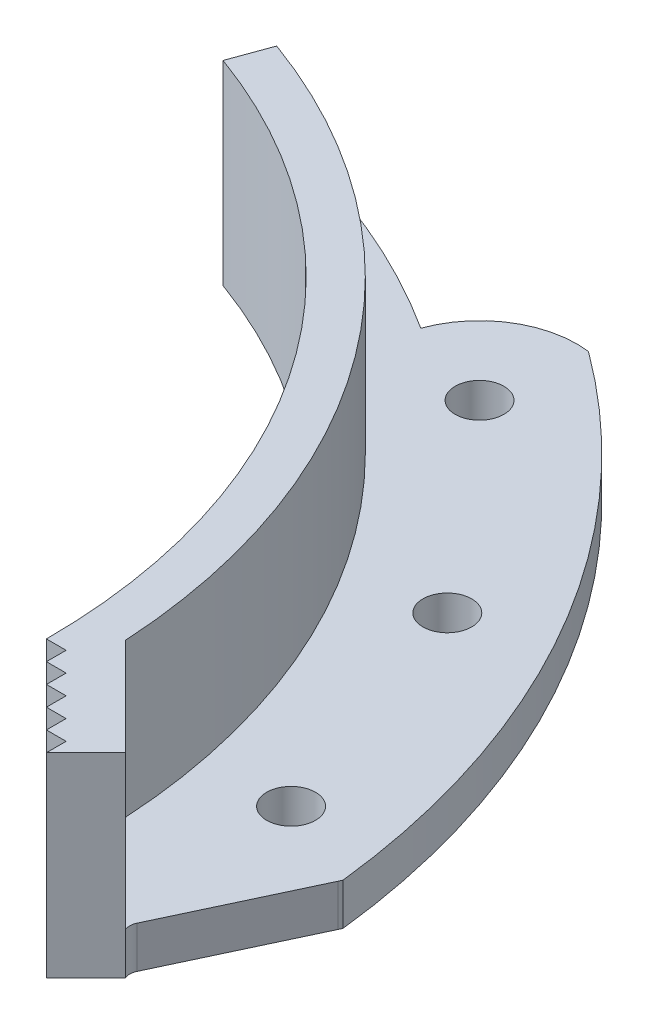
ISO-10303-21;
HEADER;
FILE_DESCRIPTION(('STEP AP214'),'2;1');
FILE_NAME('part.step','',(''),(''),'','','');
FILE_SCHEMA(('AUTOMOTIVE_DESIGN { 1 0 10303 214 1 1 1 1 }'));
ENDSEC;
DATA;
#1=APPLICATION_CONTEXT('core data for automotive mechanical design processes');
#2=APPLICATION_PROTOCOL_DEFINITION('international standard','automotive_design',2000,#1);
#3=PRODUCT_CONTEXT('',#1,'mechanical');
#4=PRODUCT('Part','Part','',(#3));
#5=PRODUCT_RELATED_PRODUCT_CATEGORY('part','',(#4));
#6=PRODUCT_DEFINITION_FORMATION('','',#4);
#7=PRODUCT_DEFINITION_CONTEXT('part definition',#1,'design');
#8=PRODUCT_DEFINITION('design','',#6,#7);
#9=PRODUCT_DEFINITION_SHAPE('','',#8);
#10=(LENGTH_UNIT() NAMED_UNIT(*) SI_UNIT(.MILLI.,.METRE.));
#11=(NAMED_UNIT(*) PLANE_ANGLE_UNIT() SI_UNIT($,.RADIAN.));
#12=(NAMED_UNIT(*) SI_UNIT($,.STERADIAN.) SOLID_ANGLE_UNIT());
#13=UNCERTAINTY_MEASURE_WITH_UNIT(LENGTH_MEASURE(1.E-05),#10,'distance_accuracy_value','');
#14=(GEOMETRIC_REPRESENTATION_CONTEXT(3) GLOBAL_UNCERTAINTY_ASSIGNED_CONTEXT((#13)) GLOBAL_UNIT_ASSIGNED_CONTEXT((#10,
#11,#12)) REPRESENTATION_CONTEXT('',''));
#15=CARTESIAN_POINT('',(0.,0.,0.));
#16=DIRECTION('',(0.,0.,1.));
#17=DIRECTION('',(1.,0.,0.));
#18=AXIS2_PLACEMENT_3D('',#15,#16,#17);
#19=CARTESIAN_POINT('',(0.,3.,0.));
#20=DIRECTION('',(0.,1.,0.));
#21=DIRECTION('',(0.,0.,1.));
#22=AXIS2_PLACEMENT_3D('',#19,#20,#21);
#23=PLANE('',#22);
#24=CARTESIAN_POINT('',(46.7653718043597,3.,-26.9999999999999));
#25=DIRECTION('',(0.,1.,0.));
#26=DIRECTION('',(0.,0.,1.));
#27=AXIS2_PLACEMENT_3D('',#24,#25,#26);
#28=CIRCLE('',#27,1.75);
#29=CARTESIAN_POINT('',(46.7653718043597,3.,-25.2499999999999));
#30=VERTEX_POINT('',#29);
#31=EDGE_CURVE('E283',#30,#30,#28,.T.);
#32=ORIENTED_EDGE('',*,*,#31,.F.);
#33=EDGE_LOOP('',(#32));
#34=FACE_BOUND('',#33,.T.);
#35=CARTESIAN_POINT('',(34.7105309230732,3.,-41.3663999284248));
#36=DIRECTION('',(0.,1.,0.));
#37=DIRECTION('',(0.,0.,1.));
#38=AXIS2_PLACEMENT_3D('',#35,#36,#37);
#39=CIRCLE('',#38,1.75);
#40=CARTESIAN_POINT('',(34.7105309230732,3.,-39.6163999284248));
#41=VERTEX_POINT('',#40);
#42=EDGE_CURVE('E289',#41,#41,#39,.T.);
#43=ORIENTED_EDGE('',*,*,#42,.F.);
#44=EDGE_LOOP('',(#43));
#45=FACE_BOUND('',#44,.T.);
#46=CARTESIAN_POINT('',(53.1796186626593,3.,-9.37700159401408));
#47=DIRECTION('',(0.,1.,0.));
#48=DIRECTION('',(0.,0.,1.));
#49=AXIS2_PLACEMENT_3D('',#46,#47,#48);
#50=CIRCLE('',#49,1.75);
#51=CARTESIAN_POINT('',(53.1796186626593,3.,-7.62700159401407));
#52=VERTEX_POINT('',#51);
#53=EDGE_CURVE('E277',#52,#52,#50,.T.);
#54=ORIENTED_EDGE('',*,*,#53,.F.);
#55=EDGE_LOOP('',(#54));
#56=FACE_BOUND('',#55,.T.);
#57=CARTESIAN_POINT('',(53.1796186626593,3.,-9.37700159401408));
#58=DIRECTION('',(0.,1.,0.));
#59=DIRECTION('',(0.,0.,1.));
#60=AXIS2_PLACEMENT_3D('',#57,#58,#59);
#61=CIRCLE('',#60,7.);
#62=CARTESIAN_POINT('',(59.5172883699741,3.,-6.40480666753561));
#63=VERTEX_POINT('',#62);
#64=CARTESIAN_POINT('',(59.6295570389033,3.,-6.65702090609462));
#65=VERTEX_POINT('',#64);
#66=EDGE_CURVE('E295',#63,#65,#61,.T.);
#67=ORIENTED_EDGE('',*,*,#66,.T.);
#68=CARTESIAN_POINT('',(0.,3.,0.));
#69=DIRECTION('',(0.,1.,0.));
#70=DIRECTION('',(0.,0.,1.));
#71=AXIS2_PLACEMENT_3D('',#68,#69,#70);
#72=CIRCLE('',#71,60.);
#73=CARTESIAN_POINT('',(35.5799277376538,3.,-48.312200759056));
#74=VERTEX_POINT('',#73);
#75=EDGE_CURVE('E184',#65,#74,#72,.T.);
#76=ORIENTED_EDGE('',*,*,#75,.T.);
#77=CARTESIAN_POINT('',(34.7105309230732,3.,-41.3663999284248));
#78=DIRECTION('',(0.,1.,0.));
#79=DIRECTION('',(0.,0.,1.));
#80=AXIS2_PLACEMENT_3D('',#77,#78,#79);
#81=CIRCLE('',#80,7.00000000000003);
#82=CARTESIAN_POINT('',(28.1245174082846,3.,-43.7379871570594));
#83=VERTEX_POINT('',#82);
#84=EDGE_CURVE('E297',#74,#83,#81,.T.);
#85=ORIENTED_EDGE('',*,*,#84,.T.);
#86=CARTESIAN_POINT('',(0.,3.,0.));
#87=DIRECTION('',(0.,1.,0.));
#88=DIRECTION('',(0.,0.,1.));
#89=AXIS2_PLACEMENT_3D('',#86,#87,#88);
#90=CIRCLE('',#89,52.);
#91=CARTESIAN_POINT('',(17.7850474529348,3.,-48.8640162808672));
#92=VERTEX_POINT('',#91);
#93=EDGE_CURVE('E299',#83,#92,#90,.T.);
#94=ORIENTED_EDGE('',*,*,#93,.T.);
#95=DIRECTION('',(-0.34202014332567,0.,0.939692620785908));
#96=VECTOR('',#95,1.);
#97=CARTESIAN_POINT('',(15.3909064496551,3.,-42.2861679353659));
#98=LINE('',#97,#96);
#99=CARTESIAN_POINT('',(16.4169668796321,3.,-45.1052457977236));
#100=VERTEX_POINT('',#99);
#101=EDGE_CURVE('E220',#92,#100,#98,.T.);
#102=ORIENTED_EDGE('',*,*,#101,.T.);
#103=CARTESIAN_POINT('',(0.,3.,0.));
#104=DIRECTION('',(0.,1.,0.));
#105=DIRECTION('',(0.,0.,1.));
#106=AXIS2_PLACEMENT_3D('',#103,#104,#105);
#107=CIRCLE('',#106,48.);
#108=CARTESIAN_POINT('',(47.9220275325259,3.,-2.73482671696649));
#109=VERTEX_POINT('',#108);
#110=EDGE_CURVE('E272',#109,#100,#107,.T.);
#111=ORIENTED_EDGE('',*,*,#110,.F.);
#112=DIRECTION('',(-0.707106781186548,0.,-0.707106781186547));
#113=VECTOR('',#112,1.);
#114=CARTESIAN_POINT('',(25.3284271247462,3.,-25.3284271247462));
#115=LINE('',#114,#113);
#116=CARTESIAN_POINT('',(54.8994949366116,3.,4.24264068711928));
#117=VERTEX_POINT('',#116);
#118=EDGE_CURVE('E48',#117,#109,#115,.T.);
#119=ORIENTED_EDGE('',*,*,#118,.F.);
#120=CARTESIAN_POINT('',(55.816015269397,3.,3.84265258780769));
#121=DIRECTION('',(0.,1.,0.));
#122=DIRECTION('',(0.,0.,1.));
#123=AXIS2_PLACEMENT_3D('',#120,#121,#122);
#124=CIRCLE('',#123,1.);
#125=CARTESIAN_POINT('',(54.9106338826378,3.,3.41805331259648));
#126=VERTEX_POINT('',#125);
#127=EDGE_CURVE('E11',#117,#126,#124,.F.);
#128=ORIENTED_EDGE('',*,*,#127,.T.);
#129=DIRECTION('',(0.424599275211209,0.,-0.905381386759258));
#130=VECTOR('',#129,1.);
#131=CARTESIAN_POINT('',(54.1923725989452,3.,4.94961597662027));
#132=LINE('',#131,#130);
#133=EDGE_CURVE('E215',#126,#63,#132,.T.);
#134=ORIENTED_EDGE('',*,*,#133,.T.);
#135=EDGE_LOOP('',(#67,#76,#85,#94,#102,#111,#119,#128,#134));
#136=FACE_BOUND('',#135,.T.);
#137=ADVANCED_FACE('F34',(#34,#45,#56,#136),#23,.T.);
#138=CARTESIAN_POINT('',(0.,0.,0.));
#139=DIRECTION('',(0.,1.,0.));
#140=DIRECTION('',(0.,0.,1.));
#141=AXIS2_PLACEMENT_3D('',#138,#139,#140);
#142=PLANE('',#141);
#143=CARTESIAN_POINT('',(53.1796186626593,0.,-9.37700159401408));
#144=DIRECTION('',(0.,1.,0.));
#145=DIRECTION('',(0.,0.,1.));
#146=AXIS2_PLACEMENT_3D('',#143,#144,#145);
#147=CIRCLE('',#146,1.75);
#148=CARTESIAN_POINT('',(53.1796186626593,0.,-7.62700159401407));
#149=VERTEX_POINT('',#148);
#150=EDGE_CURVE('E276',#149,#149,#147,.T.);
#151=ORIENTED_EDGE('',*,*,#150,.T.);
#152=EDGE_LOOP('',(#151));
#153=FACE_BOUND('',#152,.T.);
#154=CARTESIAN_POINT('',(46.7653718043597,0.,-26.9999999999999));
#155=DIRECTION('',(0.,1.,0.));
#156=DIRECTION('',(0.,0.,1.));
#157=AXIS2_PLACEMENT_3D('',#154,#155,#156);
#158=CIRCLE('',#157,1.75);
#159=CARTESIAN_POINT('',(46.7653718043597,0.,-25.2499999999999));
#160=VERTEX_POINT('',#159);
#161=EDGE_CURVE('E280',#160,#160,#158,.T.);
#162=ORIENTED_EDGE('',*,*,#161,.T.);
#163=EDGE_LOOP('',(#162));
#164=FACE_BOUND('',#163,.T.);
#165=CARTESIAN_POINT('',(34.7105309230732,0.,-41.3663999284248));
#166=DIRECTION('',(0.,1.,0.));
#167=DIRECTION('',(0.,0.,1.));
#168=AXIS2_PLACEMENT_3D('',#165,#166,#167);
#169=CIRCLE('',#168,1.75);
#170=CARTESIAN_POINT('',(34.7105309230732,0.,-39.6163999284248));
#171=VERTEX_POINT('',#170);
#172=EDGE_CURVE('E286',#171,#171,#169,.T.);
#173=ORIENTED_EDGE('',*,*,#172,.T.);
#174=EDGE_LOOP('',(#173));
#175=FACE_BOUND('',#174,.T.);
#176=CARTESIAN_POINT('',(0.,0.,0.));
#177=DIRECTION('',(0.,1.,0.));
#178=DIRECTION('',(0.,0.,1.));
#179=AXIS2_PLACEMENT_3D('',#176,#177,#178);
#180=CIRCLE('',#179,60.);
#181=CARTESIAN_POINT('',(59.6295570389033,0.,-6.65702090609462));
#182=VERTEX_POINT('',#181);
#183=CARTESIAN_POINT('',(35.5799277376538,0.,-48.312200759056));
#184=VERTEX_POINT('',#183);
#185=EDGE_CURVE('E181',#182,#184,#180,.T.);
#186=ORIENTED_EDGE('',*,*,#185,.F.);
#187=CARTESIAN_POINT('',(53.1796186626593,0.,-9.37700159401408));
#188=DIRECTION('',(0.,1.,0.));
#189=DIRECTION('',(0.,0.,1.));
#190=AXIS2_PLACEMENT_3D('',#187,#188,#189);
#191=CIRCLE('',#190,7.);
#192=CARTESIAN_POINT('',(59.5172883699741,0.,-6.40480666753561));
#193=VERTEX_POINT('',#192);
#194=EDGE_CURVE('E196',#193,#182,#191,.T.);
#195=ORIENTED_EDGE('',*,*,#194,.F.);
#196=DIRECTION('',(0.424599275211209,0.,-0.905381386759258));
#197=VECTOR('',#196,1.);
#198=CARTESIAN_POINT('',(54.1923725989452,0.,4.94961597662027));
#199=LINE('',#198,#197);
#200=CARTESIAN_POINT('',(54.9106338826378,0.,3.41805331259648));
#201=VERTEX_POINT('',#200);
#202=EDGE_CURVE('E204',#201,#193,#199,.T.);
#203=ORIENTED_EDGE('',*,*,#202,.F.);
#204=CARTESIAN_POINT('',(55.816015269397,0.,3.84265258780769));
#205=DIRECTION('',(0.,1.,0.));
#206=DIRECTION('',(0.,0.,1.));
#207=AXIS2_PLACEMENT_3D('',#204,#205,#206);
#208=CIRCLE('',#207,1.);
#209=CARTESIAN_POINT('',(54.8994949366116,0.,4.24264068711928));
#210=VERTEX_POINT('',#209);
#211=EDGE_CURVE('E42',#201,#210,#208,.T.);
#212=ORIENTED_EDGE('',*,*,#211,.T.);
#213=DIRECTION('',(0.70710678118654,0.,-0.707106781186555));
#214=VECTOR('',#213,1.);
#215=CARTESIAN_POINT('',(52.0710678118655,0.,7.07106781186548));
#216=LINE('',#215,#214);
#217=CARTESIAN_POINT('',(52.0710678118655,0.,7.07106781186548));
#218=VERTEX_POINT('',#217);
#219=EDGE_CURVE('E233',#218,#210,#216,.T.);
#220=ORIENTED_EDGE('',*,*,#219,.F.);
#221=DIRECTION('',(0.,0.,1.));
#222=VECTOR('',#221,1.);
#223=CARTESIAN_POINT('',(52.0710678118655,0.,7.07106781186548));
#224=LINE('',#223,#222);
#225=CARTESIAN_POINT('',(52.0710678118655,0.,5.65685424949239));
#226=VERTEX_POINT('',#225);
#227=EDGE_CURVE('E243',#226,#218,#224,.T.);
#228=ORIENTED_EDGE('',*,*,#227,.F.);
#229=DIRECTION('',(1.,0.,0.));
#230=VECTOR('',#229,1.);
#231=CARTESIAN_POINT('',(52.0710678118655,0.,5.65685424949239));
#232=LINE('',#231,#230);
#233=CARTESIAN_POINT('',(50.6568542494924,0.,5.65685424949239));
#234=VERTEX_POINT('',#233);
#235=EDGE_CURVE('E346',#234,#226,#232,.T.);
#236=ORIENTED_EDGE('',*,*,#235,.F.);
#237=DIRECTION('',(0.,0.,1.));
#238=VECTOR('',#237,1.);
#239=CARTESIAN_POINT('',(50.6568542494924,0.,5.65685424949239));
#240=LINE('',#239,#238);
#241=CARTESIAN_POINT('',(50.6568542494924,0.,4.2426406871193));
#242=VERTEX_POINT('',#241);
#243=EDGE_CURVE('E343',#242,#234,#240,.T.);
#244=ORIENTED_EDGE('',*,*,#243,.F.);
#245=DIRECTION('',(1.,0.,0.));
#246=VECTOR('',#245,1.);
#247=CARTESIAN_POINT('',(50.6568542494924,0.,4.2426406871193));
#248=LINE('',#247,#246);
#249=CARTESIAN_POINT('',(49.2426406871192,0.,4.24264068711929));
#250=VERTEX_POINT('',#249);
#251=EDGE_CURVE('E340',#250,#242,#248,.T.);
#252=ORIENTED_EDGE('',*,*,#251,.F.);
#253=DIRECTION('',(0.,0.,1.));
#254=VECTOR('',#253,1.);
#255=CARTESIAN_POINT('',(49.2426406871192,0.,4.24264068711929));
#256=LINE('',#255,#254);
#257=CARTESIAN_POINT('',(49.2426406871193,0.,2.82842712474621));
#258=VERTEX_POINT('',#257);
#259=EDGE_CURVE('E337',#258,#250,#256,.T.);
#260=ORIENTED_EDGE('',*,*,#259,.F.);
#261=DIRECTION('',(1.,0.,0.));
#262=VECTOR('',#261,1.);
#263=CARTESIAN_POINT('',(49.2426406871193,0.,2.82842712474621));
#264=LINE('',#263,#262);
#265=CARTESIAN_POINT('',(47.8284271247462,0.,2.82842712474622));
#266=VERTEX_POINT('',#265);
#267=EDGE_CURVE('E334',#266,#258,#264,.T.);
#268=ORIENTED_EDGE('',*,*,#267,.F.);
#269=DIRECTION('',(0.,0.,1.));
#270=VECTOR('',#269,1.);
#271=CARTESIAN_POINT('',(47.8284271247462,0.,2.82842712474622));
#272=LINE('',#271,#270);
#273=CARTESIAN_POINT('',(47.8284271247462,0.,1.41421356237313));
#274=VERTEX_POINT('',#273);
#275=EDGE_CURVE('E331',#274,#266,#272,.T.);
#276=ORIENTED_EDGE('',*,*,#275,.F.);
#277=DIRECTION('',(1.,0.,0.));
#278=VECTOR('',#277,1.);
#279=CARTESIAN_POINT('',(47.8284271247462,0.,1.41421356237313));
#280=LINE('',#279,#278);
#281=CARTESIAN_POINT('',(46.4142135623731,0.,1.41421356237313));
#282=VERTEX_POINT('',#281);
#283=EDGE_CURVE('E322',#282,#274,#280,.T.);
#284=ORIENTED_EDGE('',*,*,#283,.F.);
#285=DIRECTION('',(0.,0.,1.));
#286=VECTOR('',#285,1.);
#287=CARTESIAN_POINT('',(46.4142135623731,0.,1.41421356237313));
#288=LINE('',#287,#286);
#289=CARTESIAN_POINT('',(46.4142135623731,0.,0.));
#290=VERTEX_POINT('',#289);
#291=EDGE_CURVE('E319',#290,#282,#288,.T.);
#292=ORIENTED_EDGE('',*,*,#291,.F.);
#293=DIRECTION('',(1.,0.,5.07213462238583E-13));
#294=VECTOR('',#293,1.);
#295=CARTESIAN_POINT('',(46.4142135623731,0.,0.));
#296=LINE('',#295,#294);
#297=CARTESIAN_POINT('',(44.9999999999992,0.,-6.73072708679001E-13));
#298=VERTEX_POINT('',#297);
#299=EDGE_CURVE('E312',#298,#290,#296,.T.);
#300=ORIENTED_EDGE('',*,*,#299,.F.);
#301=CARTESIAN_POINT('',(0.,0.,0.));
#302=DIRECTION('',(0.,-1.,0.));
#303=DIRECTION('',(0.,0.,1.));
#304=AXIS2_PLACEMENT_3D('',#301,#302,#303);
#305=CIRCLE('',#304,45.);
#306=CARTESIAN_POINT('',(15.3909064496551,0.,-42.2861679353659));
#307=VERTEX_POINT('',#306);
#308=EDGE_CURVE('E208',#307,#298,#305,.T.);
#309=ORIENTED_EDGE('',*,*,#308,.F.);
#310=DIRECTION('',(-0.34202014332567,0.,0.939692620785908));
#311=VECTOR('',#310,1.);
#312=CARTESIAN_POINT('',(15.3909064496551,0.,-42.2861679353659));
#313=LINE('',#312,#311);
#314=CARTESIAN_POINT('',(17.7850474529348,0.,-48.8640162808672));
#315=VERTEX_POINT('',#314);
#316=EDGE_CURVE('E213',#315,#307,#313,.T.);
#317=ORIENTED_EDGE('',*,*,#316,.F.);
#318=CARTESIAN_POINT('',(0.,0.,0.));
#319=DIRECTION('',(0.,1.,0.));
#320=DIRECTION('',(0.,0.,1.));
#321=AXIS2_PLACEMENT_3D('',#318,#319,#320);
#322=CIRCLE('',#321,52.);
#323=CARTESIAN_POINT('',(28.1245174082846,0.,-43.7379871570594));
#324=VERTEX_POINT('',#323);
#325=EDGE_CURVE('E206',#324,#315,#322,.T.);
#326=ORIENTED_EDGE('',*,*,#325,.F.);
#327=CARTESIAN_POINT('',(34.7105309230732,0.,-41.3663999284248));
#328=DIRECTION('',(0.,1.,0.));
#329=DIRECTION('',(0.,0.,1.));
#330=AXIS2_PLACEMENT_3D('',#327,#328,#329);
#331=CIRCLE('',#330,7.00000000000003);
#332=EDGE_CURVE('E198',#184,#324,#331,.T.);
#333=ORIENTED_EDGE('',*,*,#332,.F.);
#334=EDGE_LOOP('',(#186,#195,#203,#212,#220,#228,#236,#244,#252,#260,#268,#276,#284,#292,#300,
#309,#317,#326,#333));
#335=FACE_BOUND('',#334,.T.);
#336=ADVANCED_FACE('F194',(#153,#164,#175,#335),#142,.F.);
#337=CARTESIAN_POINT('',(53.1796186626593,3.,-9.37700159401408));
#338=DIRECTION('',(0.,-1.,0.));
#339=DIRECTION('',(0.,0.,-1.));
#340=AXIS2_PLACEMENT_3D('',#337,#338,#339);
#341=CYLINDRICAL_SURFACE('',#340,7.);
#342=DIRECTION('',(0.,1.,0.));
#343=VECTOR('',#342,1.);
#344=CARTESIAN_POINT('',(59.6295570389033,7.,-6.65702090609462));
#345=LINE('',#344,#343);
#346=EDGE_CURVE('E178',#65,#182,#345,.F.);
#347=ORIENTED_EDGE('',*,*,#346,.F.);
#348=ORIENTED_EDGE('',*,*,#66,.F.);
#349=DIRECTION('',(0.,-1.,0.));
#350=VECTOR('',#349,1.);
#351=CARTESIAN_POINT('',(59.5172883699741,3.,-6.40480666753561));
#352=LINE('',#351,#350);
#353=EDGE_CURVE('E203',#63,#193,#352,.T.);
#354=ORIENTED_EDGE('',*,*,#353,.T.);
#355=ORIENTED_EDGE('',*,*,#194,.T.);
#356=EDGE_LOOP('',(#347,#348,#354,#355));
#357=FACE_BOUND('',#356,.T.);
#358=ADVANCED_FACE('F201',(#357),#341,.T.);
#359=CARTESIAN_POINT('',(34.7105309230732,3.,-41.3663999284248));
#360=DIRECTION('',(0.,-1.,0.));
#361=DIRECTION('',(0.,0.,-1.));
#362=AXIS2_PLACEMENT_3D('',#359,#360,#361);
#363=CYLINDRICAL_SURFACE('',#362,7.00000000000003);
#364=DIRECTION('',(0.,1.,0.));
#365=VECTOR('',#364,1.);
#366=CARTESIAN_POINT('',(35.5799277376538,7.,-48.312200759056));
#367=LINE('',#366,#365);
#368=EDGE_CURVE('E227',#184,#74,#367,.T.);
#369=ORIENTED_EDGE('',*,*,#368,.F.);
#370=ORIENTED_EDGE('',*,*,#332,.T.);
#371=DIRECTION('',(0.,-1.,0.));
#372=VECTOR('',#371,1.);
#373=CARTESIAN_POINT('',(28.1245174082846,3.,-43.7379871570594));
#374=LINE('',#373,#372);
#375=EDGE_CURVE('E223',#83,#324,#374,.T.);
#376=ORIENTED_EDGE('',*,*,#375,.F.);
#377=ORIENTED_EDGE('',*,*,#84,.F.);
#378=EDGE_LOOP('',(#369,#370,#376,#377));
#379=FACE_BOUND('',#378,.T.);
#380=ADVANCED_FACE('F372',(#379),#363,.T.);
#381=CARTESIAN_POINT('',(0.,3.,0.));
#382=DIRECTION('',(0.,-1.,0.));
#383=DIRECTION('',(0.,0.,-1.));
#384=AXIS2_PLACEMENT_3D('',#381,#382,#383);
#385=CYLINDRICAL_SURFACE('',#384,45.);
#386=ORIENTED_EDGE('',*,*,#308,.T.);
#387=DIRECTION('',(0.,1.,0.));
#388=VECTOR('',#387,1.);
#389=CARTESIAN_POINT('',(44.9999999999992,0.,-6.73072708679001E-13));
#390=LINE('',#389,#388);
#391=CARTESIAN_POINT('',(44.9999999999992,14.,-6.73072708679001E-13));
#392=VERTEX_POINT('',#391);
#393=EDGE_CURVE('E242',#298,#392,#390,.T.);
#394=ORIENTED_EDGE('',*,*,#393,.T.);
#395=CARTESIAN_POINT('',(0.,14.,0.));
#396=DIRECTION('',(0.,-1.,0.));
#397=DIRECTION('',(0.,0.,1.));
#398=AXIS2_PLACEMENT_3D('',#395,#396,#397);
#399=CIRCLE('',#398,44.9999999999998);
#400=CARTESIAN_POINT('',(15.3909064496552,14.,-42.2861679353662));
#401=VERTEX_POINT('',#400);
#402=EDGE_CURVE('E189',#401,#392,#399,.T.);
#403=ORIENTED_EDGE('',*,*,#402,.F.);
#404=DIRECTION('',(0.,-1.,0.));
#405=VECTOR('',#404,1.);
#406=CARTESIAN_POINT('',(15.3909064496551,3.,-42.2861679353659));
#407=LINE('',#406,#405);
#408=EDGE_CURVE('E216',#401,#307,#407,.T.);
#409=ORIENTED_EDGE('',*,*,#408,.T.);
#410=EDGE_LOOP('',(#386,#394,#403,#409));
#411=FACE_BOUND('',#410,.T.);
#412=ADVANCED_FACE('F304',(#411),#385,.F.);
#413=CARTESIAN_POINT('',(54.1923725989452,3.,4.94961597662027));
#414=DIRECTION('',(-0.905381386759258,0.,-0.424599275211208));
#415=DIRECTION('',(-0.424599275211209,0.,0.905381386759258));
#416=AXIS2_PLACEMENT_3D('',#413,#414,#415);
#417=PLANE('',#416);
#418=ORIENTED_EDGE('',*,*,#133,.F.);
#419=DIRECTION('',(0.,-1.,0.));
#420=VECTOR('',#419,1.);
#421=CARTESIAN_POINT('',(54.9106338826378,3.,3.41805331259648));
#422=LINE('',#421,#420);
#423=EDGE_CURVE('E229',#126,#201,#422,.T.);
#424=ORIENTED_EDGE('',*,*,#423,.T.);
#425=ORIENTED_EDGE('',*,*,#202,.T.);
#426=ORIENTED_EDGE('',*,*,#353,.F.);
#427=EDGE_LOOP('',(#418,#424,#425,#426));
#428=FACE_BOUND('',#427,.T.);
#429=ADVANCED_FACE('F437',(#428),#417,.F.);
#430=CARTESIAN_POINT('',(0.,3.,0.));
#431=DIRECTION('',(0.,-1.,0.));
#432=DIRECTION('',(0.,0.,-1.));
#433=AXIS2_PLACEMENT_3D('',#430,#431,#432);
#434=CYLINDRICAL_SURFACE('',#433,52.);
#435=ORIENTED_EDGE('',*,*,#325,.T.);
#436=DIRECTION('',(0.,-1.,0.));
#437=VECTOR('',#436,1.);
#438=CARTESIAN_POINT('',(17.7850474529348,3.,-48.8640162808672));
#439=LINE('',#438,#437);
#440=EDGE_CURVE('E219',#92,#315,#439,.T.);
#441=ORIENTED_EDGE('',*,*,#440,.F.);
#442=ORIENTED_EDGE('',*,*,#93,.F.);
#443=ORIENTED_EDGE('',*,*,#375,.T.);
#444=EDGE_LOOP('',(#435,#441,#442,#443));
#445=FACE_BOUND('',#444,.T.);
#446=ADVANCED_FACE('F367',(#445),#434,.T.);
#447=CARTESIAN_POINT('',(15.3909064496551,3.,-42.2861679353659));
#448=DIRECTION('',(0.939692620785908,0.,0.342020143325669));
#449=DIRECTION('',(0.342020143325669,0.,-0.939692620785908));
#450=AXIS2_PLACEMENT_3D('',#447,#448,#449);
#451=PLANE('',#450);
#452=ORIENTED_EDGE('',*,*,#316,.T.);
#453=ORIENTED_EDGE('',*,*,#408,.F.);
#454=DIRECTION('',(-0.34202014332567,0.,0.939692620785908));
#455=VECTOR('',#454,1.);
#456=CARTESIAN_POINT('',(15.3909064496552,14.,-42.2861679353662));
#457=LINE('',#456,#455);
#458=CARTESIAN_POINT('',(16.4169668796321,14.,-45.1052457977236));
#459=VERTEX_POINT('',#458);
#460=EDGE_CURVE('E320',#459,#401,#457,.T.);
#461=ORIENTED_EDGE('',*,*,#460,.F.);
#462=DIRECTION('',(0.,1.,0.));
#463=VECTOR('',#462,1.);
#464=CARTESIAN_POINT('',(16.4169668796321,0.,-45.1052457977236));
#465=LINE('',#464,#463);
#466=EDGE_CURVE('E248',#100,#459,#465,.T.);
#467=ORIENTED_EDGE('',*,*,#466,.F.);
#468=ORIENTED_EDGE('',*,*,#101,.F.);
#469=ORIENTED_EDGE('',*,*,#440,.T.);
#470=EDGE_LOOP('',(#452,#453,#461,#467,#468,#469));
#471=FACE_BOUND('',#470,.T.);
#472=ADVANCED_FACE('F364',(#471),#451,.F.);
#473=CARTESIAN_POINT('',(34.7105309230732,3.,-41.3663999284248));
#474=DIRECTION('',(0.,-1.,0.));
#475=DIRECTION('',(0.,0.,-1.));
#476=AXIS2_PLACEMENT_3D('',#473,#474,#475);
#477=CYLINDRICAL_SURFACE('',#476,1.75);
#478=ORIENTED_EDGE('',*,*,#42,.T.);
#479=EDGE_LOOP('',(#478));
#480=FACE_BOUND('',#479,.T.);
#481=ORIENTED_EDGE('',*,*,#172,.F.);
#482=EDGE_LOOP('',(#481));
#483=FACE_BOUND('',#482,.T.);
#484=ADVANCED_FACE('F430',(#480,#483),#477,.F.);
#485=CARTESIAN_POINT('',(46.7653718043597,3.,-26.9999999999999));
#486=DIRECTION('',(0.,-1.,0.));
#487=DIRECTION('',(0.,0.,-1.));
#488=AXIS2_PLACEMENT_3D('',#485,#486,#487);
#489=CYLINDRICAL_SURFACE('',#488,1.75);
#490=ORIENTED_EDGE('',*,*,#31,.T.);
#491=EDGE_LOOP('',(#490));
#492=FACE_BOUND('',#491,.T.);
#493=ORIENTED_EDGE('',*,*,#161,.F.);
#494=EDGE_LOOP('',(#493));
#495=FACE_BOUND('',#494,.T.);
#496=ADVANCED_FACE('F470',(#492,#495),#489,.F.);
#497=CARTESIAN_POINT('',(53.1796186626593,3.,-9.37700159401408));
#498=DIRECTION('',(0.,-1.,0.));
#499=DIRECTION('',(0.,0.,-1.));
#500=AXIS2_PLACEMENT_3D('',#497,#498,#499);
#501=CYLINDRICAL_SURFACE('',#500,1.75);
#502=ORIENTED_EDGE('',*,*,#53,.T.);
#503=EDGE_LOOP('',(#502));
#504=FACE_BOUND('',#503,.T.);
#505=ORIENTED_EDGE('',*,*,#150,.F.);
#506=EDGE_LOOP('',(#505));
#507=FACE_BOUND('',#506,.T.);
#508=ADVANCED_FACE('F417',(#504,#507),#501,.F.);
#509=CARTESIAN_POINT('',(0.,0.,0.));
#510=DIRECTION('',(0.,1.,0.));
#511=DIRECTION('',(0.,0.,1.));
#512=AXIS2_PLACEMENT_3D('',#509,#510,#511);
#513=CYLINDRICAL_SURFACE('',#512,48.);
#514=DIRECTION('',(0.,1.,0.));
#515=VECTOR('',#514,1.);
#516=CARTESIAN_POINT('',(47.9220275325259,0.,-2.73482671696648));
#517=LINE('',#516,#515);
#518=CARTESIAN_POINT('',(47.9220275325259,14.,-2.73482671696648));
#519=VERTEX_POINT('',#518);
#520=EDGE_CURVE('E245',#109,#519,#517,.T.);
#521=ORIENTED_EDGE('',*,*,#520,.F.);
#522=ORIENTED_EDGE('',*,*,#110,.T.);
#523=ORIENTED_EDGE('',*,*,#466,.T.);
#524=CARTESIAN_POINT('',(0.,14.,0.));
#525=DIRECTION('',(0.,1.,0.));
#526=DIRECTION('',(0.,0.,1.));
#527=AXIS2_PLACEMENT_3D('',#524,#525,#526);
#528=CIRCLE('',#527,48.);
#529=EDGE_CURVE('E325',#519,#459,#528,.T.);
#530=ORIENTED_EDGE('',*,*,#529,.F.);
#531=EDGE_LOOP('',(#521,#522,#523,#530));
#532=FACE_BOUND('',#531,.T.);
#533=ADVANCED_FACE('F354',(#532),#513,.T.);
#534=CARTESIAN_POINT('',(54.8994949366116,0.,4.24264068711928));
#535=DIRECTION('',(0.707106781186547,0.,-0.707106781186548));
#536=DIRECTION('',(-0.707106781186548,0.,-0.707106781186547));
#537=AXIS2_PLACEMENT_3D('',#534,#535,#536);
#538=PLANE('',#537);
#539=DIRECTION('',(0.,1.,0.));
#540=VECTOR('',#539,1.);
#541=CARTESIAN_POINT('',(54.8994949366116,0.,4.24264068711928));
#542=LINE('',#541,#540);
#543=CARTESIAN_POINT('',(54.8994949366116,14.,4.24264068711928));
#544=VERTEX_POINT('',#543);
#545=EDGE_CURVE('E246',#117,#544,#542,.T.);
#546=ORIENTED_EDGE('',*,*,#545,.F.);
#547=ORIENTED_EDGE('',*,*,#118,.T.);
#548=ORIENTED_EDGE('',*,*,#520,.T.);
#549=DIRECTION('',(-0.707106781186548,0.,-0.707106781186547));
#550=VECTOR('',#549,1.);
#551=CARTESIAN_POINT('',(54.8994949366116,14.,4.24264068711928));
#552=LINE('',#551,#550);
#553=EDGE_CURVE('E363',#544,#519,#552,.T.);
#554=ORIENTED_EDGE('',*,*,#553,.F.);
#555=EDGE_LOOP('',(#546,#547,#548,#554));
#556=FACE_BOUND('',#555,.T.);
#557=ADVANCED_FACE('F408',(#556),#538,.T.);
#558=CARTESIAN_POINT('',(52.0710678118655,0.,7.07106781186548));
#559=DIRECTION('',(0.707106781186555,0.,0.70710678118654));
#560=DIRECTION('',(0.70710678118654,0.,-0.707106781186555));
#561=AXIS2_PLACEMENT_3D('',#558,#559,#560);
#562=PLANE('',#561);
#563=EDGE_CURVE('E238',#210,#117,#542,.T.);
#564=ORIENTED_EDGE('',*,*,#563,.T.);
#565=ORIENTED_EDGE('',*,*,#545,.T.);
#566=DIRECTION('',(0.70710678118654,0.,-0.707106781186555));
#567=VECTOR('',#566,1.);
#568=CARTESIAN_POINT('',(52.0710678118655,14.,7.07106781186548));
#569=LINE('',#568,#567);
#570=CARTESIAN_POINT('',(52.0710678118655,14.,7.07106781186548));
#571=VERTEX_POINT('',#570);
#572=EDGE_CURVE('E404',#571,#544,#569,.T.);
#573=ORIENTED_EDGE('',*,*,#572,.F.);
#574=DIRECTION('',(0.,1.,0.));
#575=VECTOR('',#574,1.);
#576=CARTESIAN_POINT('',(52.0710678118655,0.,7.07106781186548));
#577=LINE('',#576,#575);
#578=EDGE_CURVE('E241',#218,#571,#577,.T.);
#579=ORIENTED_EDGE('',*,*,#578,.F.);
#580=ORIENTED_EDGE('',*,*,#219,.T.);
#581=EDGE_LOOP('',(#564,#565,#573,#579,#580));
#582=FACE_BOUND('',#581,.T.);
#583=ADVANCED_FACE('F237',(#582),#562,.T.);
#584=CARTESIAN_POINT('',(52.0710678118655,0.,7.07106781186548));
#585=DIRECTION('',(-1.,0.,0.));
#586=DIRECTION('',(0.,0.,1.));
#587=AXIS2_PLACEMENT_3D('',#584,#585,#586);
#588=PLANE('',#587);
#589=ORIENTED_EDGE('',*,*,#578,.T.);
#590=DIRECTION('',(0.,0.,1.));
#591=VECTOR('',#590,1.);
#592=CARTESIAN_POINT('',(52.0710678118655,14.,7.07106781186548));
#593=LINE('',#592,#591);
#594=CARTESIAN_POINT('',(52.0710678118655,14.,5.65685424949239));
#595=VERTEX_POINT('',#594);
#596=EDGE_CURVE('E401',#595,#571,#593,.T.);
#597=ORIENTED_EDGE('',*,*,#596,.F.);
#598=DIRECTION('',(0.,1.,0.));
#599=VECTOR('',#598,1.);
#600=CARTESIAN_POINT('',(52.0710678118655,0.,5.65685424949239));
#601=LINE('',#600,#599);
#602=EDGE_CURVE('E253',#226,#595,#601,.T.);
#603=ORIENTED_EDGE('',*,*,#602,.F.);
#604=ORIENTED_EDGE('',*,*,#227,.T.);
#605=EDGE_LOOP('',(#589,#597,#603,#604));
#606=FACE_BOUND('',#605,.T.);
#607=ADVANCED_FACE('F415',(#606),#588,.T.);
#608=CARTESIAN_POINT('',(52.0710678118655,0.,5.65685424949239));
#609=DIRECTION('',(0.,0.,1.));
#610=DIRECTION('',(1.,0.,0.));
#611=AXIS2_PLACEMENT_3D('',#608,#609,#610);
#612=PLANE('',#611);
#613=ORIENTED_EDGE('',*,*,#602,.T.);
#614=DIRECTION('',(1.,0.,0.));
#615=VECTOR('',#614,1.);
#616=CARTESIAN_POINT('',(52.0710678118655,14.,5.65685424949239));
#617=LINE('',#616,#615);
#618=CARTESIAN_POINT('',(50.6568542494924,14.,5.65685424949239));
#619=VERTEX_POINT('',#618);
#620=EDGE_CURVE('E398',#619,#595,#617,.T.);
#621=ORIENTED_EDGE('',*,*,#620,.F.);
#622=DIRECTION('',(0.,1.,0.));
#623=VECTOR('',#622,1.);
#624=CARTESIAN_POINT('',(50.6568542494924,0.,5.65685424949239));
#625=LINE('',#624,#623);
#626=EDGE_CURVE('E255',#234,#619,#625,.T.);
#627=ORIENTED_EDGE('',*,*,#626,.F.);
#628=ORIENTED_EDGE('',*,*,#235,.T.);
#629=EDGE_LOOP('',(#613,#621,#627,#628));
#630=FACE_BOUND('',#629,.T.);
#631=ADVANCED_FACE('F496',(#630),#612,.T.);
#632=CARTESIAN_POINT('',(50.6568542494924,0.,5.65685424949239));
#633=DIRECTION('',(-1.,0.,0.));
#634=DIRECTION('',(0.,0.,1.));
#635=AXIS2_PLACEMENT_3D('',#632,#633,#634);
#636=PLANE('',#635);
#637=ORIENTED_EDGE('',*,*,#626,.T.);
#638=DIRECTION('',(0.,0.,1.));
#639=VECTOR('',#638,1.);
#640=CARTESIAN_POINT('',(50.6568542494924,14.,5.65685424949239));
#641=LINE('',#640,#639);
#642=CARTESIAN_POINT('',(50.6568542494924,14.,4.2426406871193));
#643=VERTEX_POINT('',#642);
#644=EDGE_CURVE('E395',#643,#619,#641,.T.);
#645=ORIENTED_EDGE('',*,*,#644,.F.);
#646=DIRECTION('',(0.,1.,0.));
#647=VECTOR('',#646,1.);
#648=CARTESIAN_POINT('',(50.6568542494924,0.,4.2426406871193));
#649=LINE('',#648,#647);
#650=EDGE_CURVE('E257',#242,#643,#649,.T.);
#651=ORIENTED_EDGE('',*,*,#650,.F.);
#652=ORIENTED_EDGE('',*,*,#243,.T.);
#653=EDGE_LOOP('',(#637,#645,#651,#652));
#654=FACE_BOUND('',#653,.T.);
#655=ADVANCED_FACE('F507',(#654),#636,.T.);
#656=CARTESIAN_POINT('',(50.6568542494924,0.,4.2426406871193));
#657=DIRECTION('',(0.,0.,1.));
#658=DIRECTION('',(1.,0.,0.));
#659=AXIS2_PLACEMENT_3D('',#656,#657,#658);
#660=PLANE('',#659);
#661=ORIENTED_EDGE('',*,*,#650,.T.);
#662=DIRECTION('',(1.,0.,0.));
#663=VECTOR('',#662,1.);
#664=CARTESIAN_POINT('',(50.6568542494924,14.,4.2426406871193));
#665=LINE('',#664,#663);
#666=CARTESIAN_POINT('',(49.2426406871192,14.,4.24264068711929));
#667=VERTEX_POINT('',#666);
#668=EDGE_CURVE('E392',#667,#643,#665,.T.);
#669=ORIENTED_EDGE('',*,*,#668,.F.);
#670=DIRECTION('',(0.,1.,0.));
#671=VECTOR('',#670,1.);
#672=CARTESIAN_POINT('',(49.2426406871192,0.,4.24264068711929));
#673=LINE('',#672,#671);
#674=EDGE_CURVE('E259',#250,#667,#673,.T.);
#675=ORIENTED_EDGE('',*,*,#674,.F.);
#676=ORIENTED_EDGE('',*,*,#251,.T.);
#677=EDGE_LOOP('',(#661,#669,#675,#676));
#678=FACE_BOUND('',#677,.T.);
#679=ADVANCED_FACE('F517',(#678),#660,.T.);
#680=CARTESIAN_POINT('',(49.2426406871192,0.,4.24264068711929));
#681=DIRECTION('',(-1.,0.,0.));
#682=DIRECTION('',(0.,0.,1.));
#683=AXIS2_PLACEMENT_3D('',#680,#681,#682);
#684=PLANE('',#683);
#685=ORIENTED_EDGE('',*,*,#674,.T.);
#686=DIRECTION('',(0.,0.,1.));
#687=VECTOR('',#686,1.);
#688=CARTESIAN_POINT('',(49.2426406871192,14.,4.24264068711929));
#689=LINE('',#688,#687);
#690=CARTESIAN_POINT('',(49.2426406871193,14.,2.82842712474621));
#691=VERTEX_POINT('',#690);
#692=EDGE_CURVE('E389',#691,#667,#689,.T.);
#693=ORIENTED_EDGE('',*,*,#692,.F.);
#694=DIRECTION('',(0.,1.,0.));
#695=VECTOR('',#694,1.);
#696=CARTESIAN_POINT('',(49.2426406871193,0.,2.82842712474621));
#697=LINE('',#696,#695);
#698=EDGE_CURVE('E261',#258,#691,#697,.T.);
#699=ORIENTED_EDGE('',*,*,#698,.F.);
#700=ORIENTED_EDGE('',*,*,#259,.T.);
#701=EDGE_LOOP('',(#685,#693,#699,#700));
#702=FACE_BOUND('',#701,.T.);
#703=ADVANCED_FACE('F527',(#702),#684,.T.);
#704=CARTESIAN_POINT('',(49.2426406871193,0.,2.82842712474621));
#705=DIRECTION('',(0.,0.,1.));
#706=DIRECTION('',(1.,0.,0.));
#707=AXIS2_PLACEMENT_3D('',#704,#705,#706);
#708=PLANE('',#707);
#709=ORIENTED_EDGE('',*,*,#698,.T.);
#710=DIRECTION('',(1.,0.,0.));
#711=VECTOR('',#710,1.);
#712=CARTESIAN_POINT('',(49.2426406871193,14.,2.82842712474621));
#713=LINE('',#712,#711);
#714=CARTESIAN_POINT('',(47.8284271247462,14.,2.82842712474622));
#715=VERTEX_POINT('',#714);
#716=EDGE_CURVE('E386',#715,#691,#713,.T.);
#717=ORIENTED_EDGE('',*,*,#716,.F.);
#718=DIRECTION('',(0.,1.,0.));
#719=VECTOR('',#718,1.);
#720=CARTESIAN_POINT('',(47.8284271247462,0.,2.82842712474622));
#721=LINE('',#720,#719);
#722=EDGE_CURVE('E263',#266,#715,#721,.T.);
#723=ORIENTED_EDGE('',*,*,#722,.F.);
#724=ORIENTED_EDGE('',*,*,#267,.T.);
#725=EDGE_LOOP('',(#709,#717,#723,#724));
#726=FACE_BOUND('',#725,.T.);
#727=ADVANCED_FACE('F537',(#726),#708,.T.);
#728=CARTESIAN_POINT('',(47.8284271247462,0.,2.82842712474622));
#729=DIRECTION('',(-1.,0.,0.));
#730=DIRECTION('',(0.,0.,1.));
#731=AXIS2_PLACEMENT_3D('',#728,#729,#730);
#732=PLANE('',#731);
#733=ORIENTED_EDGE('',*,*,#722,.T.);
#734=DIRECTION('',(0.,0.,1.));
#735=VECTOR('',#734,1.);
#736=CARTESIAN_POINT('',(47.8284271247462,14.,2.82842712474622));
#737=LINE('',#736,#735);
#738=CARTESIAN_POINT('',(47.8284271247462,14.,1.41421356237313));
#739=VERTEX_POINT('',#738);
#740=EDGE_CURVE('E383',#739,#715,#737,.T.);
#741=ORIENTED_EDGE('',*,*,#740,.F.);
#742=DIRECTION('',(0.,1.,0.));
#743=VECTOR('',#742,1.);
#744=CARTESIAN_POINT('',(47.8284271247462,0.,1.41421356237313));
#745=LINE('',#744,#743);
#746=EDGE_CURVE('E265',#274,#739,#745,.T.);
#747=ORIENTED_EDGE('',*,*,#746,.F.);
#748=ORIENTED_EDGE('',*,*,#275,.T.);
#749=EDGE_LOOP('',(#733,#741,#747,#748));
#750=FACE_BOUND('',#749,.T.);
#751=ADVANCED_FACE('F547',(#750),#732,.T.);
#752=CARTESIAN_POINT('',(47.8284271247462,0.,1.41421356237313));
#753=DIRECTION('',(0.,0.,1.));
#754=DIRECTION('',(1.,0.,0.));
#755=AXIS2_PLACEMENT_3D('',#752,#753,#754);
#756=PLANE('',#755);
#757=ORIENTED_EDGE('',*,*,#746,.T.);
#758=DIRECTION('',(1.,0.,0.));
#759=VECTOR('',#758,1.);
#760=CARTESIAN_POINT('',(47.8284271247462,14.,1.41421356237313));
#761=LINE('',#760,#759);
#762=CARTESIAN_POINT('',(46.4142135623731,14.,1.41421356237313));
#763=VERTEX_POINT('',#762);
#764=EDGE_CURVE('E380',#763,#739,#761,.T.);
#765=ORIENTED_EDGE('',*,*,#764,.F.);
#766=DIRECTION('',(0.,1.,0.));
#767=VECTOR('',#766,1.);
#768=CARTESIAN_POINT('',(46.4142135623731,0.,1.41421356237313));
#769=LINE('',#768,#767);
#770=EDGE_CURVE('E267',#282,#763,#769,.T.);
#771=ORIENTED_EDGE('',*,*,#770,.F.);
#772=ORIENTED_EDGE('',*,*,#283,.T.);
#773=EDGE_LOOP('',(#757,#765,#771,#772));
#774=FACE_BOUND('',#773,.T.);
#775=ADVANCED_FACE('F557',(#774),#756,.T.);
#776=CARTESIAN_POINT('',(46.4142135623731,0.,1.41421356237313));
#777=DIRECTION('',(-1.,0.,0.));
#778=DIRECTION('',(0.,0.,1.));
#779=AXIS2_PLACEMENT_3D('',#776,#777,#778);
#780=PLANE('',#779);
#781=ORIENTED_EDGE('',*,*,#770,.T.);
#782=DIRECTION('',(0.,0.,1.));
#783=VECTOR('',#782,1.);
#784=CARTESIAN_POINT('',(46.4142135623731,14.,1.41421356237313));
#785=LINE('',#784,#783);
#786=CARTESIAN_POINT('',(46.4142135623731,14.,0.));
#787=VERTEX_POINT('',#786);
#788=EDGE_CURVE('E377',#787,#763,#785,.T.);
#789=ORIENTED_EDGE('',*,*,#788,.F.);
#790=DIRECTION('',(0.,1.,0.));
#791=VECTOR('',#790,1.);
#792=CARTESIAN_POINT('',(46.4142135623731,0.,0.));
#793=LINE('',#792,#791);
#794=EDGE_CURVE('E269',#290,#787,#793,.T.);
#795=ORIENTED_EDGE('',*,*,#794,.F.);
#796=ORIENTED_EDGE('',*,*,#291,.T.);
#797=EDGE_LOOP('',(#781,#789,#795,#796));
#798=FACE_BOUND('',#797,.T.);
#799=ADVANCED_FACE('F567',(#798),#780,.T.);
#800=CARTESIAN_POINT('',(46.4142135623731,0.,0.));
#801=DIRECTION('',(-5.07213462238583E-13,0.,1.));
#802=DIRECTION('',(1.,0.,5.07213462238583E-13));
#803=AXIS2_PLACEMENT_3D('',#800,#801,#802);
#804=PLANE('',#803);
#805=ORIENTED_EDGE('',*,*,#794,.T.);
#806=DIRECTION('',(1.,0.,5.07213462238583E-13));
#807=VECTOR('',#806,1.);
#808=CARTESIAN_POINT('',(46.4142135623731,14.,0.));
#809=LINE('',#808,#807);
#810=EDGE_CURVE('E314',#392,#787,#809,.T.);
#811=ORIENTED_EDGE('',*,*,#810,.F.);
#812=ORIENTED_EDGE('',*,*,#393,.F.);
#813=ORIENTED_EDGE('',*,*,#299,.T.);
#814=EDGE_LOOP('',(#805,#811,#812,#813));
#815=FACE_BOUND('',#814,.T.);
#816=ADVANCED_FACE('F311',(#815),#804,.T.);
#817=CARTESIAN_POINT('',(0.,14.,0.));
#818=DIRECTION('',(0.,1.,0.));
#819=DIRECTION('',(0.,0.,1.));
#820=AXIS2_PLACEMENT_3D('',#817,#818,#819);
#821=PLANE('',#820);
#822=ORIENTED_EDGE('',*,*,#402,.T.);
#823=ORIENTED_EDGE('',*,*,#810,.T.);
#824=ORIENTED_EDGE('',*,*,#788,.T.);
#825=ORIENTED_EDGE('',*,*,#764,.T.);
#826=ORIENTED_EDGE('',*,*,#740,.T.);
#827=ORIENTED_EDGE('',*,*,#716,.T.);
#828=ORIENTED_EDGE('',*,*,#692,.T.);
#829=ORIENTED_EDGE('',*,*,#668,.T.);
#830=ORIENTED_EDGE('',*,*,#644,.T.);
#831=ORIENTED_EDGE('',*,*,#620,.T.);
#832=ORIENTED_EDGE('',*,*,#596,.T.);
#833=ORIENTED_EDGE('',*,*,#572,.T.);
#834=ORIENTED_EDGE('',*,*,#553,.T.);
#835=ORIENTED_EDGE('',*,*,#529,.T.);
#836=ORIENTED_EDGE('',*,*,#460,.T.);
#837=EDGE_LOOP('',(#822,#823,#824,#825,#826,#827,#828,#829,#830,#831,#832,#833,#834,#835,#836));
#838=FACE_BOUND('',#837,.T.);
#839=ADVANCED_FACE('F360',(#838),#821,.T.);
#840=CARTESIAN_POINT('',(0.,0.,0.));
#841=DIRECTION('',(0.,1.,0.));
#842=DIRECTION('',(0.,0.,1.));
#843=AXIS2_PLACEMENT_3D('',#840,#841,#842);
#844=CYLINDRICAL_SURFACE('',#843,60.);
#845=ORIENTED_EDGE('',*,*,#346,.T.);
#846=ORIENTED_EDGE('',*,*,#185,.T.);
#847=ORIENTED_EDGE('',*,*,#368,.T.);
#848=ORIENTED_EDGE('',*,*,#75,.F.);
#849=EDGE_LOOP('',(#845,#846,#847,#848));
#850=FACE_BOUND('',#849,.T.);
#851=ADVANCED_FACE('F180',(#850),#844,.T.);
#852=CARTESIAN_POINT('',(55.816015269397,0.,3.84265258780769));
#853=DIRECTION('',(0.,-1.,0.));
#854=DIRECTION('',(0.,0.,-1.));
#855=AXIS2_PLACEMENT_3D('',#852,#853,#854);
#856=CYLINDRICAL_SURFACE('',#855,1.);
#857=ORIENTED_EDGE('',*,*,#127,.F.);
#858=ORIENTED_EDGE('',*,*,#563,.F.);
#859=ORIENTED_EDGE('',*,*,#211,.F.);
#860=ORIENTED_EDGE('',*,*,#423,.F.);
#861=EDGE_LOOP('',(#857,#858,#859,#860));
#862=FACE_BOUND('',#861,.T.);
#863=ADVANCED_FACE('F36',(#862),#856,.F.);
#864=CLOSED_SHELL('',(#137,#336,#358,#380,#412,#429,#446,#472,#484,#496,#508,#533,#557,#583,
#607,#631,#655,#679,#703,#727,#751,#775,#799,#816,#839,#851,#863));
#865=MANIFOLD_SOLID_BREP('B2',#864);
#866=ADVANCED_BREP_SHAPE_REPRESENTATION('',(#18,#865),#14);
#867=SHAPE_DEFINITION_REPRESENTATION(#9,#866);
ENDSEC;
END-ISO-10303-21;
